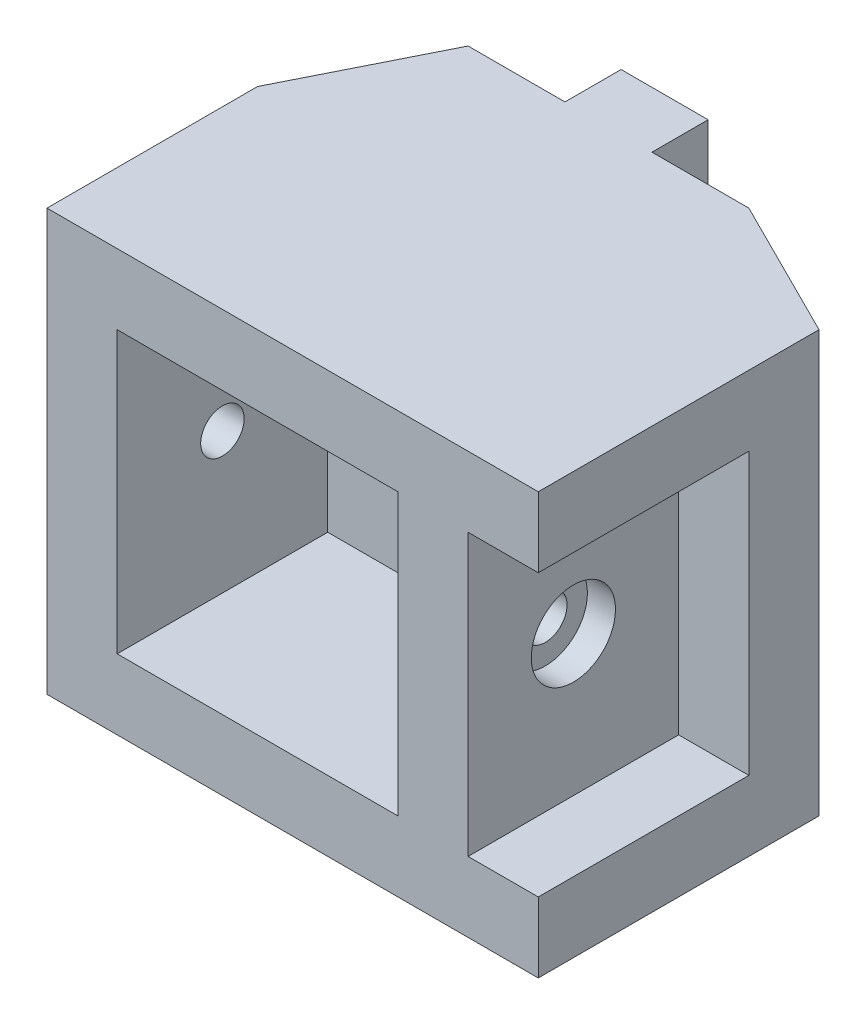
ISO-10303-21;
HEADER;
FILE_DESCRIPTION(('STEP AP214'),'2;1');
FILE_NAME('part.step','',(''),(''),'','','');
FILE_SCHEMA(('AUTOMOTIVE_DESIGN { 1 0 10303 214 1 1 1 1 }'));
ENDSEC;
DATA;
#1=APPLICATION_CONTEXT('core data for automotive mechanical design processes');
#2=APPLICATION_PROTOCOL_DEFINITION('international standard','automotive_design',2000,#1);
#3=PRODUCT_CONTEXT('',#1,'mechanical');
#4=PRODUCT('Part','Part','',(#3));
#5=PRODUCT_RELATED_PRODUCT_CATEGORY('part','',(#4));
#6=PRODUCT_DEFINITION_FORMATION('','',#4);
#7=PRODUCT_DEFINITION_CONTEXT('part definition',#1,'design');
#8=PRODUCT_DEFINITION('design','',#6,#7);
#9=PRODUCT_DEFINITION_SHAPE('','',#8);
#10=(LENGTH_UNIT() NAMED_UNIT(*) SI_UNIT(.MILLI.,.METRE.));
#11=(NAMED_UNIT(*) PLANE_ANGLE_UNIT() SI_UNIT($,.RADIAN.));
#12=(NAMED_UNIT(*) SI_UNIT($,.STERADIAN.) SOLID_ANGLE_UNIT());
#13=UNCERTAINTY_MEASURE_WITH_UNIT(LENGTH_MEASURE(1.E-05),#10,'distance_accuracy_value','');
#14=(GEOMETRIC_REPRESENTATION_CONTEXT(3) GLOBAL_UNCERTAINTY_ASSIGNED_CONTEXT((#13)) GLOBAL_UNIT_ASSIGNED_CONTEXT((#10,
#11,#12)) REPRESENTATION_CONTEXT('',''));
#15=CARTESIAN_POINT('',(0.,0.,0.));
#16=DIRECTION('',(0.,0.,1.));
#17=DIRECTION('',(1.,0.,0.));
#18=AXIS2_PLACEMENT_3D('',#15,#16,#17);
#19=CARTESIAN_POINT('',(0.,0.,0.));
#20=DIRECTION('',(0.,0.,1.));
#21=DIRECTION('',(1.,0.,0.));
#22=AXIS2_PLACEMENT_3D('',#19,#20,#21);
#23=PLANE('',#22);
#24=DIRECTION('',(1.,0.,0.));
#25=VECTOR('',#24,1.);
#26=CARTESIAN_POINT('',(0.,-15.,0.));
#27=LINE('',#26,#25);
#28=CARTESIAN_POINT('',(-3.1,-15.,0.));
#29=VERTEX_POINT('',#28);
#30=CARTESIAN_POINT('',(3.1,-15.,0.));
#31=VERTEX_POINT('',#30);
#32=EDGE_CURVE('E474',#29,#31,#27,.T.);
#33=ORIENTED_EDGE('',*,*,#32,.F.);
#34=DIRECTION('',(0.,1.,0.));
#35=VECTOR('',#34,1.);
#36=CARTESIAN_POINT('',(-3.1,-22.,0.));
#37=LINE('',#36,#35);
#38=CARTESIAN_POINT('',(-3.1,-3.1,0.));
#39=VERTEX_POINT('',#38);
#40=EDGE_CURVE('E334',#29,#39,#37,.T.);
#41=ORIENTED_EDGE('',*,*,#40,.T.);
#42=DIRECTION('',(-1.,0.,0.));
#43=VECTOR('',#42,1.);
#44=CARTESIAN_POINT('',(3.1,-3.1,0.));
#45=LINE('',#44,#43);
#46=CARTESIAN_POINT('',(3.1,-3.1,0.));
#47=VERTEX_POINT('',#46);
#48=EDGE_CURVE('E312',#47,#39,#45,.T.);
#49=ORIENTED_EDGE('',*,*,#48,.F.);
#50=DIRECTION('',(0.,1.,0.));
#51=VECTOR('',#50,1.);
#52=CARTESIAN_POINT('',(3.1,-22.,0.));
#53=LINE('',#52,#51);
#54=EDGE_CURVE('E340',#31,#47,#53,.T.);
#55=ORIENTED_EDGE('',*,*,#54,.F.);
#56=EDGE_LOOP('',(#33,#41,#49,#55));
#57=FACE_BOUND('',#56,.T.);
#58=ADVANCED_FACE('F72',(#57),#23,.F.);
#59=CARTESIAN_POINT('',(3.1,-22.,0.));
#60=DIRECTION('',(1.,0.,0.));
#61=DIRECTION('',(0.,0.,-1.));
#62=AXIS2_PLACEMENT_3D('',#59,#60,#61);
#63=PLANE('',#62);
#64=DIRECTION('',(0.,1.,0.));
#65=VECTOR('',#64,1.);
#66=CARTESIAN_POINT('',(3.1,-22.,4.));
#67=LINE('',#66,#65);
#68=CARTESIAN_POINT('',(3.1,-15.,4.));
#69=VERTEX_POINT('',#68);
#70=CARTESIAN_POINT('',(3.1,-3.1,4.));
#71=VERTEX_POINT('',#70);
#72=EDGE_CURVE('E343',#69,#71,#67,.T.);
#73=ORIENTED_EDGE('',*,*,#72,.F.);
#74=DIRECTION('',(0.,0.,-1.));
#75=VECTOR('',#74,1.);
#76=CARTESIAN_POINT('',(3.1,-15.,0.));
#77=LINE('',#76,#75);
#78=EDGE_CURVE('E479',#69,#31,#77,.T.);
#79=ORIENTED_EDGE('',*,*,#78,.T.);
#80=ORIENTED_EDGE('',*,*,#54,.T.);
#81=DIRECTION('',(0.,0.,-1.));
#82=VECTOR('',#81,1.);
#83=CARTESIAN_POINT('',(3.1,-3.1,4.));
#84=LINE('',#83,#82);
#85=EDGE_CURVE('E325',#71,#47,#84,.T.);
#86=ORIENTED_EDGE('',*,*,#85,.F.);
#87=EDGE_LOOP('',(#73,#79,#80,#86));
#88=FACE_BOUND('',#87,.T.);
#89=ADVANCED_FACE('F465',(#88),#63,.T.);
#90=CARTESIAN_POINT('',(-3.1,-22.,0.));
#91=DIRECTION('',(-1.,0.,0.));
#92=DIRECTION('',(0.,0.,1.));
#93=AXIS2_PLACEMENT_3D('',#90,#91,#92);
#94=PLANE('',#93);
#95=ORIENTED_EDGE('',*,*,#40,.F.);
#96=DIRECTION('',(0.,0.,1.));
#97=VECTOR('',#96,1.);
#98=CARTESIAN_POINT('',(-3.1,-15.,0.));
#99=LINE('',#98,#97);
#100=CARTESIAN_POINT('',(-3.1,-15.,4.));
#101=VERTEX_POINT('',#100);
#102=EDGE_CURVE('E478',#29,#101,#99,.T.);
#103=ORIENTED_EDGE('',*,*,#102,.T.);
#104=DIRECTION('',(0.,1.,0.));
#105=VECTOR('',#104,1.);
#106=CARTESIAN_POINT('',(-3.1,-22.,4.));
#107=LINE('',#106,#105);
#108=CARTESIAN_POINT('',(-3.1,-3.1,4.));
#109=VERTEX_POINT('',#108);
#110=EDGE_CURVE('E330',#101,#109,#107,.T.);
#111=ORIENTED_EDGE('',*,*,#110,.T.);
#112=DIRECTION('',(0.,0.,-1.));
#113=VECTOR('',#112,1.);
#114=CARTESIAN_POINT('',(-3.1,-3.1,4.));
#115=LINE('',#114,#113);
#116=EDGE_CURVE('E322',#109,#39,#115,.T.);
#117=ORIENTED_EDGE('',*,*,#116,.T.);
#118=EDGE_LOOP('',(#95,#103,#111,#117));
#119=FACE_BOUND('',#118,.T.);
#120=ADVANCED_FACE('F470',(#119),#94,.T.);
#121=CARTESIAN_POINT('',(0.,-22.,4.));
#122=DIRECTION('',(0.,0.,-1.));
#123=DIRECTION('',(-1.,0.,0.));
#124=AXIS2_PLACEMENT_3D('',#121,#122,#123);
#125=PLANE('',#124);
#126=DIRECTION('',(-1.,0.,0.));
#127=VECTOR('',#126,1.);
#128=CARTESIAN_POINT('',(0.,15.,4.));
#129=LINE('',#128,#127);
#130=CARTESIAN_POINT('',(10.,15.,4.));
#131=VERTEX_POINT('',#130);
#132=CARTESIAN_POINT('',(3.1,15.,4.));
#133=VERTEX_POINT('',#132);
#134=EDGE_CURVE('E228',#131,#133,#129,.T.);
#135=ORIENTED_EDGE('',*,*,#134,.F.);
#136=DIRECTION('',(0.,1.,0.));
#137=VECTOR('',#136,1.);
#138=CARTESIAN_POINT('',(10.,-22.,4.));
#139=LINE('',#138,#137);
#140=CARTESIAN_POINT('',(10.,-15.,3.99999999999999));
#141=VERTEX_POINT('',#140);
#142=EDGE_CURVE('E337',#141,#131,#139,.T.);
#143=ORIENTED_EDGE('',*,*,#142,.F.);
#144=DIRECTION('',(-1.,0.,0.));
#145=VECTOR('',#144,1.);
#146=CARTESIAN_POINT('',(0.,-15.,4.));
#147=LINE('',#146,#145);
#148=EDGE_CURVE('E366',#141,#69,#147,.T.);
#149=ORIENTED_EDGE('',*,*,#148,.T.);
#150=ORIENTED_EDGE('',*,*,#72,.T.);
#151=DIRECTION('',(-1.,0.,0.));
#152=VECTOR('',#151,1.);
#153=CARTESIAN_POINT('',(3.1,-3.1,4.));
#154=LINE('',#153,#152);
#155=EDGE_CURVE('E311',#71,#109,#154,.T.);
#156=ORIENTED_EDGE('',*,*,#155,.T.);
#157=ORIENTED_EDGE('',*,*,#110,.F.);
#158=CARTESIAN_POINT('',(-10.,-15.,4.));
#159=VERTEX_POINT('',#158);
#160=EDGE_CURVE('E229',#101,#159,#147,.T.);
#161=ORIENTED_EDGE('',*,*,#160,.T.);
#162=DIRECTION('',(0.,1.,0.));
#163=VECTOR('',#162,1.);
#164=CARTESIAN_POINT('',(-10.,-22.,4.));
#165=LINE('',#164,#163);
#166=CARTESIAN_POINT('',(-10.,15.,4.));
#167=VERTEX_POINT('',#166);
#168=EDGE_CURVE('E225',#159,#167,#165,.T.);
#169=ORIENTED_EDGE('',*,*,#168,.T.);
#170=CARTESIAN_POINT('',(-3.1,15.,4.));
#171=VERTEX_POINT('',#170);
#172=EDGE_CURVE('E374',#171,#167,#129,.T.);
#173=ORIENTED_EDGE('',*,*,#172,.F.);
#174=CARTESIAN_POINT('',(-3.1,3.1,4.));
#175=VERTEX_POINT('',#174);
#176=EDGE_CURVE('E332',#175,#171,#107,.T.);
#177=ORIENTED_EDGE('',*,*,#176,.F.);
#178=DIRECTION('',(1.,0.,0.));
#179=VECTOR('',#178,1.);
#180=CARTESIAN_POINT('',(-3.1,3.1,4.));
#181=LINE('',#180,#179);
#182=CARTESIAN_POINT('',(3.1,3.1,4.));
#183=VERTEX_POINT('',#182);
#184=EDGE_CURVE('E308',#175,#183,#181,.T.);
#185=ORIENTED_EDGE('',*,*,#184,.T.);
#186=EDGE_CURVE('E321',#183,#133,#67,.T.);
#187=ORIENTED_EDGE('',*,*,#186,.T.);
#188=EDGE_LOOP('',(#135,#143,#149,#150,#156,#157,#161,#169,#173,#177,#185,#187));
#189=FACE_BOUND('',#188,.T.);
#190=CARTESIAN_POINT('',(0.,0.,4.));
#191=DIRECTION('',(0.,0.,1.));
#192=DIRECTION('',(1.,0.,0.));
#193=AXIS2_PLACEMENT_3D('',#190,#191,#192);
#194=CIRCLE('',#193,2.6);
#195=CARTESIAN_POINT('',(2.6,0.,4.));
#196=VERTEX_POINT('',#195);
#197=EDGE_CURVE('E296',#196,#196,#194,.T.);
#198=ORIENTED_EDGE('',*,*,#197,.T.);
#199=EDGE_LOOP('',(#198));
#200=FACE_BOUND('',#199,.T.);
#201=ADVANCED_FACE('F364',(#189,#200),#125,.T.);
#202=CARTESIAN_POINT('',(-6.4,-22.,-3.2));
#203=DIRECTION('',(0.894427190999916,0.,0.447213595499958));
#204=DIRECTION('',(0.447213595499958,0.,-0.894427190999916));
#205=AXIS2_PLACEMENT_3D('',#202,#203,#204);
#206=PLANE('',#205);
#207=DIRECTION('',(0.,-1.,0.));
#208=VECTOR('',#207,1.);
#209=CARTESIAN_POINT('',(-15.,0.,14.));
#210=LINE('',#209,#208);
#211=CARTESIAN_POINT('',(-15.,15.,14.));
#212=VERTEX_POINT('',#211);
#213=CARTESIAN_POINT('',(-15.,-15.,14.));
#214=VERTEX_POINT('',#213);
#215=EDGE_CURVE('E223',#212,#214,#210,.T.);
#216=ORIENTED_EDGE('',*,*,#215,.F.);
#217=DIRECTION('',(0.447213595499958,0.,-0.894427190999916));
#218=VECTOR('',#217,1.);
#219=CARTESIAN_POINT('',(-6.4,15.,-3.2));
#220=LINE('',#219,#218);
#221=EDGE_CURVE('E377',#212,#167,#220,.T.);
#222=ORIENTED_EDGE('',*,*,#221,.T.);
#223=ORIENTED_EDGE('',*,*,#168,.F.);
#224=DIRECTION('',(0.447213595499958,0.,-0.894427190999916));
#225=VECTOR('',#224,1.);
#226=CARTESIAN_POINT('',(-6.4,-15.,-3.2));
#227=LINE('',#226,#225);
#228=EDGE_CURVE('E218',#214,#159,#227,.T.);
#229=ORIENTED_EDGE('',*,*,#228,.F.);
#230=EDGE_LOOP('',(#216,#222,#223,#229));
#231=FACE_BOUND('',#230,.T.);
#232=ADVANCED_FACE('F220',(#231),#206,.F.);
#233=CARTESIAN_POINT('',(20.,22.,9.));
#234=DIRECTION('',(1.,0.,0.));
#235=DIRECTION('',(0.,1.,0.));
#236=AXIS2_PLACEMENT_3D('',#233,#234,#235);
#237=PLANE('',#236);
#238=DIRECTION('',(0.,-1.,0.));
#239=VECTOR('',#238,1.);
#240=CARTESIAN_POINT('',(20.,22.,9.));
#241=LINE('',#240,#239);
#242=CARTESIAN_POINT('',(20.,15.,9.));
#243=VERTEX_POINT('',#242);
#244=CARTESIAN_POINT('',(20.,-15.,9.));
#245=VERTEX_POINT('',#244);
#246=EDGE_CURVE('E275',#243,#245,#241,.T.);
#247=ORIENTED_EDGE('',*,*,#246,.F.);
#248=DIRECTION('',(0.,0.,-1.));
#249=VECTOR('',#248,1.);
#250=CARTESIAN_POINT('',(20.,15.,29.));
#251=LINE('',#250,#249);
#252=CARTESIAN_POINT('',(20.,15.,29.));
#253=VERTEX_POINT('',#252);
#254=EDGE_CURVE('E284',#253,#243,#251,.T.);
#255=ORIENTED_EDGE('',*,*,#254,.F.);
#256=DIRECTION('',(0.,1.,0.));
#257=VECTOR('',#256,1.);
#258=CARTESIAN_POINT('',(20.,0.,29.));
#259=LINE('',#258,#257);
#260=CARTESIAN_POINT('',(20.,10.,29.));
#261=VERTEX_POINT('',#260);
#262=EDGE_CURVE('E407',#261,#253,#259,.T.);
#263=ORIENTED_EDGE('',*,*,#262,.F.);
#264=DIRECTION('',(0.,0.,-1.));
#265=VECTOR('',#264,1.);
#266=CARTESIAN_POINT('',(20.,10.,29.));
#267=LINE('',#266,#265);
#268=CARTESIAN_POINT('',(20.,10.,14.));
#269=VERTEX_POINT('',#268);
#270=EDGE_CURVE('E286',#261,#269,#267,.T.);
#271=ORIENTED_EDGE('',*,*,#270,.T.);
#272=DIRECTION('',(0.,-1.,0.));
#273=VECTOR('',#272,1.);
#274=CARTESIAN_POINT('',(20.,22.,14.));
#275=LINE('',#274,#273);
#276=CARTESIAN_POINT('',(20.,-9.99999999999999,14.));
#277=VERTEX_POINT('',#276);
#278=EDGE_CURVE('E292',#269,#277,#275,.T.);
#279=ORIENTED_EDGE('',*,*,#278,.T.);
#280=DIRECTION('',(0.,0.,-1.));
#281=VECTOR('',#280,1.);
#282=CARTESIAN_POINT('',(20.,-9.99999999999999,29.));
#283=LINE('',#282,#281);
#284=CARTESIAN_POINT('',(20.,-9.99999999999999,29.));
#285=VERTEX_POINT('',#284);
#286=EDGE_CURVE('E278',#285,#277,#283,.T.);
#287=ORIENTED_EDGE('',*,*,#286,.F.);
#288=DIRECTION('',(0.,1.,0.));
#289=VECTOR('',#288,1.);
#290=CARTESIAN_POINT('',(20.,0.,29.));
#291=LINE('',#290,#289);
#292=CARTESIAN_POINT('',(20.,-15.,29.));
#293=VERTEX_POINT('',#292);
#294=EDGE_CURVE('E413',#293,#285,#291,.T.);
#295=ORIENTED_EDGE('',*,*,#294,.F.);
#296=DIRECTION('',(0.,0.,-1.));
#297=VECTOR('',#296,1.);
#298=CARTESIAN_POINT('',(20.,-15.,29.));
#299=LINE('',#298,#297);
#300=EDGE_CURVE('E240',#293,#245,#299,.T.);
#301=ORIENTED_EDGE('',*,*,#300,.T.);
#302=EDGE_LOOP('',(#247,#255,#263,#271,#279,#287,#295,#301));
#303=FACE_BOUND('',#302,.T.);
#304=ADVANCED_FACE('F523',(#303),#237,.T.);
#305=CARTESIAN_POINT('',(10.,22.,4.));
#306=DIRECTION('',(0.447213595499958,0.,-0.894427190999916));
#307=DIRECTION('',(-0.894427190999916,0.,-0.447213595499958));
#308=AXIS2_PLACEMENT_3D('',#305,#306,#307);
#309=PLANE('',#308);
#310=DIRECTION('',(-0.894427190999916,0.,-0.447213595499958));
#311=VECTOR('',#310,1.);
#312=CARTESIAN_POINT('',(10.,15.,4.));
#313=LINE('',#312,#311);
#314=EDGE_CURVE('E12',#243,#131,#313,.T.);
#315=ORIENTED_EDGE('',*,*,#314,.F.);
#316=ORIENTED_EDGE('',*,*,#246,.T.);
#317=DIRECTION('',(-0.894427190999916,0.,-0.447213595499958));
#318=VECTOR('',#317,1.);
#319=CARTESIAN_POINT('',(10.,-15.,3.99999999999999));
#320=LINE('',#319,#318);
#321=EDGE_CURVE('E79',#245,#141,#320,.T.);
#322=ORIENTED_EDGE('',*,*,#321,.T.);
#323=ORIENTED_EDGE('',*,*,#142,.T.);
#324=EDGE_LOOP('',(#315,#316,#322,#323));
#325=FACE_BOUND('',#324,.T.);
#326=ADVANCED_FACE('F359',(#325),#309,.T.);
#327=CARTESIAN_POINT('',(-20.,0.,21.5));
#328=DIRECTION('',(1.,0.,0.));
#329=DIRECTION('',(0.,0.,-1.));
#330=AXIS2_PLACEMENT_3D('',#327,#328,#329);
#331=CYLINDRICAL_SURFACE('',#330,1.55);
#332=CARTESIAN_POINT('',(-10.,0.,21.5));
#333=DIRECTION('',(1.,0.,0.));
#334=DIRECTION('',(0.,0.,-1.));
#335=AXIS2_PLACEMENT_3D('',#332,#333,#334);
#336=CIRCLE('',#335,1.55);
#337=CARTESIAN_POINT('',(-10.,0.,19.95));
#338=VERTEX_POINT('',#337);
#339=EDGE_CURVE('E400',#338,#338,#336,.T.);
#340=ORIENTED_EDGE('',*,*,#339,.T.);
#341=EDGE_LOOP('',(#340));
#342=FACE_BOUND('',#341,.T.);
#343=CARTESIAN_POINT('',(-13.,0.,21.5));
#344=DIRECTION('',(-1.,0.,0.));
#345=DIRECTION('',(0.,-1.,0.));
#346=AXIS2_PLACEMENT_3D('',#343,#344,#345);
#347=CIRCLE('',#346,1.55);
#348=CARTESIAN_POINT('',(-13.,-1.55,21.5));
#349=VERTEX_POINT('',#348);
#350=EDGE_CURVE('E350',#349,#349,#347,.F.);
#351=ORIENTED_EDGE('',*,*,#350,.F.);
#352=EDGE_LOOP('',(#351));
#353=FACE_BOUND('',#352,.T.);
#354=ADVANCED_FACE('F456',(#342,#353),#331,.F.);
#355=CARTESIAN_POINT('',(15.,0.,21.5));
#356=DIRECTION('',(-1.,0.,0.));
#357=DIRECTION('',(0.,-1.,0.));
#358=AXIS2_PLACEMENT_3D('',#355,#356,#357);
#359=CYLINDRICAL_SURFACE('',#358,1.55);
#360=CARTESIAN_POINT('',(10.,0.,21.5));
#361=DIRECTION('',(1.,0.,0.));
#362=DIRECTION('',(0.,0.,-1.));
#363=AXIS2_PLACEMENT_3D('',#360,#361,#362);
#364=CIRCLE('',#363,1.55);
#365=CARTESIAN_POINT('',(10.,0.,19.95));
#366=VERTEX_POINT('',#365);
#367=EDGE_CURVE('E348',#366,#366,#364,.F.);
#368=ORIENTED_EDGE('',*,*,#367,.T.);
#369=EDGE_LOOP('',(#368));
#370=FACE_BOUND('',#369,.T.);
#371=CARTESIAN_POINT('',(13.,0.,21.5));
#372=DIRECTION('',(1.,0.,0.));
#373=DIRECTION('',(0.,0.,-1.));
#374=AXIS2_PLACEMENT_3D('',#371,#372,#373);
#375=CIRCLE('',#374,1.55);
#376=CARTESIAN_POINT('',(13.,0.,19.95));
#377=VERTEX_POINT('',#376);
#378=EDGE_CURVE('E345',#377,#377,#375,.T.);
#379=ORIENTED_EDGE('',*,*,#378,.T.);
#380=EDGE_LOOP('',(#379));
#381=FACE_BOUND('',#380,.T.);
#382=ADVANCED_FACE('F447',(#370,#381),#359,.F.);
#383=CARTESIAN_POINT('',(0.,0.,14.));
#384=DIRECTION('',(0.,0.,1.));
#385=DIRECTION('',(1.,0.,0.));
#386=AXIS2_PLACEMENT_3D('',#383,#384,#385);
#387=PLANE('',#386);
#388=CARTESIAN_POINT('',(0.,0.,14.));
#389=DIRECTION('',(0.,0.,1.));
#390=DIRECTION('',(1.,0.,0.));
#391=AXIS2_PLACEMENT_3D('',#388,#389,#390);
#392=CIRCLE('',#391,4.);
#393=CARTESIAN_POINT('',(4.,0.,14.));
#394=VERTEX_POINT('',#393);
#395=EDGE_CURVE('E299',#394,#394,#392,.T.);
#396=ORIENTED_EDGE('',*,*,#395,.F.);
#397=EDGE_LOOP('',(#396));
#398=FACE_BOUND('',#397,.T.);
#399=DIRECTION('',(0.,-1.,0.));
#400=VECTOR('',#399,1.);
#401=CARTESIAN_POINT('',(10.,0.,14.));
#402=LINE('',#401,#400);
#403=CARTESIAN_POINT('',(10.,10.,14.));
#404=VERTEX_POINT('',#403);
#405=CARTESIAN_POINT('',(10.,-10.,14.));
#406=VERTEX_POINT('',#405);
#407=EDGE_CURVE('E253',#404,#406,#402,.T.);
#408=ORIENTED_EDGE('',*,*,#407,.F.);
#409=DIRECTION('',(-1.,0.,0.));
#410=VECTOR('',#409,1.);
#411=CARTESIAN_POINT('',(0.,10.,14.));
#412=LINE('',#411,#410);
#413=CARTESIAN_POINT('',(-10.,10.,14.));
#414=VERTEX_POINT('',#413);
#415=EDGE_CURVE('E247',#404,#414,#412,.T.);
#416=ORIENTED_EDGE('',*,*,#415,.T.);
#417=DIRECTION('',(0.,1.,0.));
#418=VECTOR('',#417,1.);
#419=CARTESIAN_POINT('',(-10.,0.,14.));
#420=LINE('',#419,#418);
#421=CARTESIAN_POINT('',(-10.,-10.,14.));
#422=VERTEX_POINT('',#421);
#423=EDGE_CURVE('E258',#422,#414,#420,.T.);
#424=ORIENTED_EDGE('',*,*,#423,.F.);
#425=DIRECTION('',(1.,0.,0.));
#426=VECTOR('',#425,1.);
#427=CARTESIAN_POINT('',(0.,-10.,14.));
#428=LINE('',#427,#426);
#429=EDGE_CURVE('E256',#422,#406,#428,.T.);
#430=ORIENTED_EDGE('',*,*,#429,.T.);
#431=EDGE_LOOP('',(#408,#416,#424,#430));
#432=FACE_BOUND('',#431,.T.);
#433=ADVANCED_FACE('F444',(#398,#432),#387,.T.);
#434=CARTESIAN_POINT('',(-3.1,3.1,0.));
#435=VERTEX_POINT('',#434);
#436=CARTESIAN_POINT('',(-3.1,15.,0.));
#437=VERTEX_POINT('',#436);
#438=EDGE_CURVE('E336',#435,#437,#37,.T.);
#439=ORIENTED_EDGE('',*,*,#438,.T.);
#440=DIRECTION('',(1.,0.,0.));
#441=VECTOR('',#440,1.);
#442=CARTESIAN_POINT('',(0.,15.,0.));
#443=LINE('',#442,#441);
#444=CARTESIAN_POINT('',(3.1,15.,0.));
#445=VERTEX_POINT('',#444);
#446=EDGE_CURVE('E375',#437,#445,#443,.T.);
#447=ORIENTED_EDGE('',*,*,#446,.T.);
#448=CARTESIAN_POINT('',(3.1,3.1,0.));
#449=VERTEX_POINT('',#448);
#450=EDGE_CURVE('E342',#449,#445,#53,.T.);
#451=ORIENTED_EDGE('',*,*,#450,.F.);
#452=DIRECTION('',(1.,0.,0.));
#453=VECTOR('',#452,1.);
#454=CARTESIAN_POINT('',(-3.1,3.1,0.));
#455=LINE('',#454,#453);
#456=EDGE_CURVE('E305',#435,#449,#455,.T.);
#457=ORIENTED_EDGE('',*,*,#456,.F.);
#458=EDGE_LOOP('',(#439,#447,#451,#457));
#459=FACE_BOUND('',#458,.T.);
#460=ADVANCED_FACE('F446',(#459),#23,.F.);
#461=DIRECTION('',(0.,0.,-1.));
#462=VECTOR('',#461,1.);
#463=CARTESIAN_POINT('',(3.1,15.,0.));
#464=LINE('',#463,#462);
#465=EDGE_CURVE('E372',#133,#445,#464,.T.);
#466=ORIENTED_EDGE('',*,*,#465,.F.);
#467=ORIENTED_EDGE('',*,*,#186,.F.);
#468=DIRECTION('',(0.,0.,-1.));
#469=VECTOR('',#468,1.);
#470=CARTESIAN_POINT('',(3.1,3.1,4.));
#471=LINE('',#470,#469);
#472=EDGE_CURVE('E315',#183,#449,#471,.T.);
#473=ORIENTED_EDGE('',*,*,#472,.T.);
#474=ORIENTED_EDGE('',*,*,#450,.T.);
#475=EDGE_LOOP('',(#466,#467,#473,#474));
#476=FACE_BOUND('',#475,.T.);
#477=ADVANCED_FACE('F454',(#476),#63,.T.);
#478=DIRECTION('',(0.,0.,1.));
#479=VECTOR('',#478,1.);
#480=CARTESIAN_POINT('',(-3.1,15.,0.));
#481=LINE('',#480,#479);
#482=EDGE_CURVE('E378',#437,#171,#481,.T.);
#483=ORIENTED_EDGE('',*,*,#482,.F.);
#484=ORIENTED_EDGE('',*,*,#438,.F.);
#485=DIRECTION('',(0.,0.,-1.));
#486=VECTOR('',#485,1.);
#487=CARTESIAN_POINT('',(-3.1,3.1,4.));
#488=LINE('',#487,#486);
#489=EDGE_CURVE('E319',#175,#435,#488,.T.);
#490=ORIENTED_EDGE('',*,*,#489,.F.);
#491=ORIENTED_EDGE('',*,*,#176,.T.);
#492=EDGE_LOOP('',(#483,#484,#490,#491));
#493=FACE_BOUND('',#492,.T.);
#494=ADVANCED_FACE('F463',(#493),#94,.T.);
#495=DIRECTION('',(-1.,0.,0.));
#496=VECTOR('',#495,1.);
#497=CARTESIAN_POINT('',(0.,-10.,14.));
#498=LINE('',#497,#496);
#499=CARTESIAN_POINT('',(15.,-10.,14.));
#500=VERTEX_POINT('',#499);
#501=EDGE_CURVE('E244',#277,#500,#498,.T.);
#502=ORIENTED_EDGE('',*,*,#501,.F.);
#503=ORIENTED_EDGE('',*,*,#278,.F.);
#504=DIRECTION('',(1.,0.,0.));
#505=VECTOR('',#504,1.);
#506=CARTESIAN_POINT('',(0.,10.,14.));
#507=LINE('',#506,#505);
#508=CARTESIAN_POINT('',(15.,10.,14.));
#509=VERTEX_POINT('',#508);
#510=EDGE_CURVE('E91',#509,#269,#507,.T.);
#511=ORIENTED_EDGE('',*,*,#510,.F.);
#512=DIRECTION('',(0.,-1.,0.));
#513=VECTOR('',#512,1.);
#514=CARTESIAN_POINT('',(15.,0.,14.));
#515=LINE('',#514,#513);
#516=EDGE_CURVE('E86',#509,#500,#515,.T.);
#517=ORIENTED_EDGE('',*,*,#516,.T.);
#518=EDGE_LOOP('',(#502,#503,#511,#517));
#519=FACE_BOUND('',#518,.T.);
#520=ADVANCED_FACE('F449',(#519),#387,.T.);
#521=CARTESIAN_POINT('',(-3.1,3.1,4.));
#522=DIRECTION('',(0.,1.,0.));
#523=DIRECTION('',(0.,0.,1.));
#524=AXIS2_PLACEMENT_3D('',#521,#522,#523);
#525=PLANE('',#524);
#526=ORIENTED_EDGE('',*,*,#456,.T.);
#527=ORIENTED_EDGE('',*,*,#472,.F.);
#528=ORIENTED_EDGE('',*,*,#184,.F.);
#529=ORIENTED_EDGE('',*,*,#489,.T.);
#530=EDGE_LOOP('',(#526,#527,#528,#529));
#531=FACE_BOUND('',#530,.T.);
#532=ADVANCED_FACE('F462',(#531),#525,.F.);
#533=CARTESIAN_POINT('',(3.1,-3.1,4.));
#534=DIRECTION('',(0.,-1.,0.));
#535=DIRECTION('',(1.,0.,0.));
#536=AXIS2_PLACEMENT_3D('',#533,#534,#535);
#537=PLANE('',#536);
#538=ORIENTED_EDGE('',*,*,#48,.T.);
#539=ORIENTED_EDGE('',*,*,#116,.F.);
#540=ORIENTED_EDGE('',*,*,#155,.F.);
#541=ORIENTED_EDGE('',*,*,#85,.T.);
#542=EDGE_LOOP('',(#538,#539,#540,#541));
#543=FACE_BOUND('',#542,.T.);
#544=ADVANCED_FACE('F487',(#543),#537,.F.);
#545=CARTESIAN_POINT('',(0.,0.,9.));
#546=DIRECTION('',(0.,0.,1.));
#547=DIRECTION('',(1.,0.,0.));
#548=AXIS2_PLACEMENT_3D('',#545,#546,#547);
#549=CYLINDRICAL_SURFACE('',#548,4.);
#550=CARTESIAN_POINT('',(0.,0.,9.));
#551=DIRECTION('',(0.,0.,1.));
#552=DIRECTION('',(1.,0.,0.));
#553=AXIS2_PLACEMENT_3D('',#550,#551,#552);
#554=CIRCLE('',#553,4.);
#555=CARTESIAN_POINT('',(4.,0.,9.));
#556=VERTEX_POINT('',#555);
#557=EDGE_CURVE('E302',#556,#556,#554,.T.);
#558=ORIENTED_EDGE('',*,*,#557,.F.);
#559=EDGE_LOOP('',(#558));
#560=FACE_BOUND('',#559,.T.);
#561=ORIENTED_EDGE('',*,*,#395,.T.);
#562=EDGE_LOOP('',(#561));
#563=FACE_BOUND('',#562,.T.);
#564=ADVANCED_FACE('F534',(#560,#563),#549,.F.);
#565=CARTESIAN_POINT('',(0.,0.,9.));
#566=DIRECTION('',(0.,0.,1.));
#567=DIRECTION('',(1.,0.,0.));
#568=AXIS2_PLACEMENT_3D('',#565,#566,#567);
#569=PLANE('',#568);
#570=CARTESIAN_POINT('',(0.,0.,9.));
#571=DIRECTION('',(0.,0.,1.));
#572=DIRECTION('',(1.,0.,0.));
#573=AXIS2_PLACEMENT_3D('',#570,#571,#572);
#574=CIRCLE('',#573,2.6);
#575=CARTESIAN_POINT('',(2.6,0.,9.));
#576=VERTEX_POINT('',#575);
#577=EDGE_CURVE('E295',#576,#576,#574,.T.);
#578=ORIENTED_EDGE('',*,*,#577,.F.);
#579=EDGE_LOOP('',(#578));
#580=FACE_BOUND('',#579,.T.);
#581=ORIENTED_EDGE('',*,*,#557,.T.);
#582=EDGE_LOOP('',(#581));
#583=FACE_BOUND('',#582,.T.);
#584=ADVANCED_FACE('F530',(#580,#583),#569,.T.);
#585=CARTESIAN_POINT('',(0.,0.,4.));
#586=DIRECTION('',(0.,0.,1.));
#587=DIRECTION('',(1.,0.,0.));
#588=AXIS2_PLACEMENT_3D('',#585,#586,#587);
#589=CYLINDRICAL_SURFACE('',#588,2.6);
#590=ORIENTED_EDGE('',*,*,#197,.F.);
#591=EDGE_LOOP('',(#590));
#592=FACE_BOUND('',#591,.T.);
#593=ORIENTED_EDGE('',*,*,#577,.T.);
#594=EDGE_LOOP('',(#593));
#595=FACE_BOUND('',#594,.T.);
#596=ADVANCED_FACE('F527',(#592,#595),#589,.F.);
#597=CARTESIAN_POINT('',(0.,10.,29.));
#598=DIRECTION('',(0.,-1.,0.));
#599=DIRECTION('',(0.,0.,-1.));
#600=AXIS2_PLACEMENT_3D('',#597,#598,#599);
#601=PLANE('',#600);
#602=ORIENTED_EDGE('',*,*,#415,.F.);
#603=DIRECTION('',(0.,0.,-1.));
#604=VECTOR('',#603,1.);
#605=CARTESIAN_POINT('',(10.,10.,29.));
#606=LINE('',#605,#604);
#607=CARTESIAN_POINT('',(10.,10.,29.));
#608=VERTEX_POINT('',#607);
#609=EDGE_CURVE('E272',#608,#404,#606,.T.);
#610=ORIENTED_EDGE('',*,*,#609,.F.);
#611=DIRECTION('',(-1.,0.,0.));
#612=VECTOR('',#611,1.);
#613=CARTESIAN_POINT('',(0.,10.,29.));
#614=LINE('',#613,#612);
#615=CARTESIAN_POINT('',(-10.,10.,29.));
#616=VERTEX_POINT('',#615);
#617=EDGE_CURVE('E417',#608,#616,#614,.T.);
#618=ORIENTED_EDGE('',*,*,#617,.T.);
#619=DIRECTION('',(0.,0.,-1.));
#620=VECTOR('',#619,1.);
#621=CARTESIAN_POINT('',(-10.,10.,29.));
#622=LINE('',#621,#620);
#623=EDGE_CURVE('E262',#616,#414,#622,.T.);
#624=ORIENTED_EDGE('',*,*,#623,.T.);
#625=EDGE_LOOP('',(#602,#610,#618,#624));
#626=FACE_BOUND('',#625,.T.);
#627=ADVANCED_FACE('F435',(#626),#601,.T.);
#628=CARTESIAN_POINT('',(10.,0.,29.));
#629=DIRECTION('',(1.,0.,0.));
#630=DIRECTION('',(0.,0.,-1.));
#631=AXIS2_PLACEMENT_3D('',#628,#629,#630);
#632=PLANE('',#631);
#633=ORIENTED_EDGE('',*,*,#367,.F.);
#634=EDGE_LOOP('',(#633));
#635=FACE_BOUND('',#634,.T.);
#636=ORIENTED_EDGE('',*,*,#407,.T.);
#637=DIRECTION('',(0.,0.,-1.));
#638=VECTOR('',#637,1.);
#639=CARTESIAN_POINT('',(10.,-10.,29.));
#640=LINE('',#639,#638);
#641=CARTESIAN_POINT('',(10.,-10.,29.));
#642=VERTEX_POINT('',#641);
#643=EDGE_CURVE('E269',#642,#406,#640,.T.);
#644=ORIENTED_EDGE('',*,*,#643,.F.);
#645=DIRECTION('',(0.,-1.,0.));
#646=VECTOR('',#645,1.);
#647=CARTESIAN_POINT('',(10.,0.,29.));
#648=LINE('',#647,#646);
#649=EDGE_CURVE('E420',#608,#642,#648,.T.);
#650=ORIENTED_EDGE('',*,*,#649,.F.);
#651=ORIENTED_EDGE('',*,*,#609,.T.);
#652=EDGE_LOOP('',(#636,#644,#650,#651));
#653=FACE_BOUND('',#652,.T.);
#654=ADVANCED_FACE('F439',(#635,#653),#632,.F.);
#655=CARTESIAN_POINT('',(0.,-10.,29.));
#656=DIRECTION('',(0.,1.,0.));
#657=DIRECTION('',(0.,0.,1.));
#658=AXIS2_PLACEMENT_3D('',#655,#656,#657);
#659=PLANE('',#658);
#660=ORIENTED_EDGE('',*,*,#429,.F.);
#661=DIRECTION('',(0.,0.,-1.));
#662=VECTOR('',#661,1.);
#663=CARTESIAN_POINT('',(-10.,-10.,29.));
#664=LINE('',#663,#662);
#665=CARTESIAN_POINT('',(-10.,-10.,29.));
#666=VERTEX_POINT('',#665);
#667=EDGE_CURVE('E265',#666,#422,#664,.T.);
#668=ORIENTED_EDGE('',*,*,#667,.F.);
#669=DIRECTION('',(1.,0.,0.));
#670=VECTOR('',#669,1.);
#671=CARTESIAN_POINT('',(0.,-10.,29.));
#672=LINE('',#671,#670);
#673=EDGE_CURVE('E422',#666,#642,#672,.T.);
#674=ORIENTED_EDGE('',*,*,#673,.T.);
#675=ORIENTED_EDGE('',*,*,#643,.T.);
#676=EDGE_LOOP('',(#660,#668,#674,#675));
#677=FACE_BOUND('',#676,.T.);
#678=ADVANCED_FACE('F442',(#677),#659,.T.);
#679=CARTESIAN_POINT('',(15.,0.,29.));
#680=DIRECTION('',(1.,0.,0.));
#681=DIRECTION('',(0.,0.,-1.));
#682=AXIS2_PLACEMENT_3D('',#679,#680,#681);
#683=PLANE('',#682);
#684=CARTESIAN_POINT('',(15.,0.,21.5));
#685=DIRECTION('',(1.,0.,0.));
#686=DIRECTION('',(0.,0.,-1.));
#687=AXIS2_PLACEMENT_3D('',#684,#685,#686);
#688=CIRCLE('',#687,3.);
#689=CARTESIAN_POINT('',(15.,0.,18.5));
#690=VERTEX_POINT('',#689);
#691=EDGE_CURVE('E352',#690,#690,#688,.T.);
#692=ORIENTED_EDGE('',*,*,#691,.F.);
#693=EDGE_LOOP('',(#692));
#694=FACE_BOUND('',#693,.T.);
#695=ORIENTED_EDGE('',*,*,#516,.F.);
#696=DIRECTION('',(0.,0.,-1.));
#697=VECTOR('',#696,1.);
#698=CARTESIAN_POINT('',(15.,10.,29.));
#699=LINE('',#698,#697);
#700=CARTESIAN_POINT('',(15.,10.,29.));
#701=VERTEX_POINT('',#700);
#702=EDGE_CURVE('E266',#701,#509,#699,.T.);
#703=ORIENTED_EDGE('',*,*,#702,.F.);
#704=DIRECTION('',(0.,-1.,0.));
#705=VECTOR('',#704,1.);
#706=CARTESIAN_POINT('',(15.,0.,29.));
#707=LINE('',#706,#705);
#708=CARTESIAN_POINT('',(15.,-10.,29.));
#709=VERTEX_POINT('',#708);
#710=EDGE_CURVE('E261',#701,#709,#707,.T.);
#711=ORIENTED_EDGE('',*,*,#710,.T.);
#712=DIRECTION('',(0.,0.,-1.));
#713=VECTOR('',#712,1.);
#714=CARTESIAN_POINT('',(15.,-10.,29.));
#715=LINE('',#714,#713);
#716=EDGE_CURVE('E276',#709,#500,#715,.T.);
#717=ORIENTED_EDGE('',*,*,#716,.T.);
#718=EDGE_LOOP('',(#695,#703,#711,#717));
#719=FACE_BOUND('',#718,.T.);
#720=ADVANCED_FACE('F513',(#694,#719),#683,.T.);
#721=CARTESIAN_POINT('',(0.,10.,29.));
#722=DIRECTION('',(0.,1.,0.));
#723=DIRECTION('',(0.,0.,1.));
#724=AXIS2_PLACEMENT_3D('',#721,#722,#723);
#725=PLANE('',#724);
#726=ORIENTED_EDGE('',*,*,#510,.T.);
#727=ORIENTED_EDGE('',*,*,#270,.F.);
#728=DIRECTION('',(1.,0.,0.));
#729=VECTOR('',#728,1.);
#730=CARTESIAN_POINT('',(0.,10.,29.));
#731=LINE('',#730,#729);
#732=EDGE_CURVE('E405',#701,#261,#731,.T.);
#733=ORIENTED_EDGE('',*,*,#732,.F.);
#734=ORIENTED_EDGE('',*,*,#702,.T.);
#735=EDGE_LOOP('',(#726,#727,#733,#734));
#736=FACE_BOUND('',#735,.T.);
#737=ADVANCED_FACE('F505',(#736),#725,.F.);
#738=CARTESIAN_POINT('',(0.,15.,29.));
#739=DIRECTION('',(0.,1.,0.));
#740=DIRECTION('',(0.,0.,1.));
#741=AXIS2_PLACEMENT_3D('',#738,#739,#740);
#742=PLANE('',#741);
#743=ORIENTED_EDGE('',*,*,#254,.T.);
#744=ORIENTED_EDGE('',*,*,#314,.T.);
#745=ORIENTED_EDGE('',*,*,#134,.T.);
#746=ORIENTED_EDGE('',*,*,#465,.T.);
#747=ORIENTED_EDGE('',*,*,#446,.F.);
#748=ORIENTED_EDGE('',*,*,#482,.T.);
#749=ORIENTED_EDGE('',*,*,#172,.T.);
#750=ORIENTED_EDGE('',*,*,#221,.F.);
#751=DIRECTION('',(0.,0.,-1.));
#752=VECTOR('',#751,1.);
#753=CARTESIAN_POINT('',(-15.,15.,29.));
#754=LINE('',#753,#752);
#755=CARTESIAN_POINT('',(-15.,15.,29.));
#756=VERTEX_POINT('',#755);
#757=EDGE_CURVE('E239',#756,#212,#754,.T.);
#758=ORIENTED_EDGE('',*,*,#757,.F.);
#759=DIRECTION('',(1.,0.,0.));
#760=VECTOR('',#759,1.);
#761=CARTESIAN_POINT('',(-15.,15.,29.));
#762=LINE('',#761,#760);
#763=EDGE_CURVE('E380',#756,#253,#762,.T.);
#764=ORIENTED_EDGE('',*,*,#763,.T.);
#765=EDGE_LOOP('',(#743,#744,#745,#746,#747,#748,#749,#750,#758,#764));
#766=FACE_BOUND('',#765,.T.);
#767=ADVANCED_FACE('F503',(#766),#742,.T.);
#768=CARTESIAN_POINT('',(-15.,0.,29.));
#769=DIRECTION('',(1.,0.,0.));
#770=DIRECTION('',(0.,1.,0.));
#771=AXIS2_PLACEMENT_3D('',#768,#769,#770);
#772=PLANE('',#771);
#773=CARTESIAN_POINT('',(-15.,0.,21.5));
#774=DIRECTION('',(-1.,0.,0.));
#775=DIRECTION('',(0.,-1.,0.));
#776=AXIS2_PLACEMENT_3D('',#773,#774,#775);
#777=CIRCLE('',#776,3.);
#778=CARTESIAN_POINT('',(-15.,-3.,21.5));
#779=VERTEX_POINT('',#778);
#780=EDGE_CURVE('E389',#779,#779,#777,.T.);
#781=ORIENTED_EDGE('',*,*,#780,.F.);
#782=EDGE_LOOP('',(#781));
#783=FACE_BOUND('',#782,.T.);
#784=DIRECTION('',(0.,-1.,0.));
#785=VECTOR('',#784,1.);
#786=CARTESIAN_POINT('',(-15.,0.,29.));
#787=LINE('',#786,#785);
#788=CARTESIAN_POINT('',(-15.,-15.,29.));
#789=VERTEX_POINT('',#788);
#790=EDGE_CURVE('E410',#756,#789,#787,.T.);
#791=ORIENTED_EDGE('',*,*,#790,.F.);
#792=ORIENTED_EDGE('',*,*,#757,.T.);
#793=ORIENTED_EDGE('',*,*,#215,.T.);
#794=DIRECTION('',(0.,0.,-1.));
#795=VECTOR('',#794,1.);
#796=CARTESIAN_POINT('',(-15.,-15.,29.));
#797=LINE('',#796,#795);
#798=EDGE_CURVE('E233',#789,#214,#797,.T.);
#799=ORIENTED_EDGE('',*,*,#798,.F.);
#800=EDGE_LOOP('',(#791,#792,#793,#799));
#801=FACE_BOUND('',#800,.T.);
#802=ADVANCED_FACE('F243',(#783,#801),#772,.F.);
#803=CARTESIAN_POINT('',(0.,-15.,29.));
#804=DIRECTION('',(0.,-1.,0.));
#805=DIRECTION('',(0.,0.,-1.));
#806=AXIS2_PLACEMENT_3D('',#803,#804,#805);
#807=PLANE('',#806);
#808=ORIENTED_EDGE('',*,*,#798,.T.);
#809=ORIENTED_EDGE('',*,*,#228,.T.);
#810=ORIENTED_EDGE('',*,*,#160,.F.);
#811=ORIENTED_EDGE('',*,*,#102,.F.);
#812=ORIENTED_EDGE('',*,*,#32,.T.);
#813=ORIENTED_EDGE('',*,*,#78,.F.);
#814=ORIENTED_EDGE('',*,*,#148,.F.);
#815=ORIENTED_EDGE('',*,*,#321,.F.);
#816=ORIENTED_EDGE('',*,*,#300,.F.);
#817=DIRECTION('',(-1.,0.,0.));
#818=VECTOR('',#817,1.);
#819=CARTESIAN_POINT('',(0.,-15.,29.));
#820=LINE('',#819,#818);
#821=EDGE_CURVE('E236',#293,#789,#820,.T.);
#822=ORIENTED_EDGE('',*,*,#821,.T.);
#823=EDGE_LOOP('',(#808,#809,#810,#811,#812,#813,#814,#815,#816,#822));
#824=FACE_BOUND('',#823,.T.);
#825=ADVANCED_FACE('F234',(#824),#807,.T.);
#826=CARTESIAN_POINT('',(0.,-10.,29.));
#827=DIRECTION('',(0.,-1.,0.));
#828=DIRECTION('',(1.,0.,0.));
#829=AXIS2_PLACEMENT_3D('',#826,#827,#828);
#830=PLANE('',#829);
#831=ORIENTED_EDGE('',*,*,#501,.T.);
#832=ORIENTED_EDGE('',*,*,#716,.F.);
#833=DIRECTION('',(-1.,0.,0.));
#834=VECTOR('',#833,1.);
#835=CARTESIAN_POINT('',(0.,-10.,29.));
#836=LINE('',#835,#834);
#837=EDGE_CURVE('E415',#285,#709,#836,.T.);
#838=ORIENTED_EDGE('',*,*,#837,.F.);
#839=ORIENTED_EDGE('',*,*,#286,.T.);
#840=EDGE_LOOP('',(#831,#832,#838,#839));
#841=FACE_BOUND('',#840,.T.);
#842=ADVANCED_FACE('F704',(#841),#830,.F.);
#843=CARTESIAN_POINT('',(-10.,0.,29.));
#844=DIRECTION('',(-1.,0.,0.));
#845=DIRECTION('',(0.,0.,1.));
#846=AXIS2_PLACEMENT_3D('',#843,#844,#845);
#847=PLANE('',#846);
#848=ORIENTED_EDGE('',*,*,#339,.F.);
#849=EDGE_LOOP('',(#848));
#850=FACE_BOUND('',#849,.T.);
#851=ORIENTED_EDGE('',*,*,#423,.T.);
#852=ORIENTED_EDGE('',*,*,#623,.F.);
#853=DIRECTION('',(0.,1.,0.));
#854=VECTOR('',#853,1.);
#855=CARTESIAN_POINT('',(-10.,0.,29.));
#856=LINE('',#855,#854);
#857=EDGE_CURVE('E279',#666,#616,#856,.T.);
#858=ORIENTED_EDGE('',*,*,#857,.F.);
#859=ORIENTED_EDGE('',*,*,#667,.T.);
#860=EDGE_LOOP('',(#851,#852,#858,#859));
#861=FACE_BOUND('',#860,.T.);
#862=ADVANCED_FACE('F432',(#850,#861),#847,.F.);
#863=CARTESIAN_POINT('',(0.,0.,29.));
#864=DIRECTION('',(0.,0.,1.));
#865=DIRECTION('',(1.,0.,0.));
#866=AXIS2_PLACEMENT_3D('',#863,#864,#865);
#867=PLANE('',#866);
#868=ORIENTED_EDGE('',*,*,#763,.F.);
#869=ORIENTED_EDGE('',*,*,#790,.T.);
#870=ORIENTED_EDGE('',*,*,#821,.F.);
#871=ORIENTED_EDGE('',*,*,#294,.T.);
#872=ORIENTED_EDGE('',*,*,#837,.T.);
#873=ORIENTED_EDGE('',*,*,#710,.F.);
#874=ORIENTED_EDGE('',*,*,#732,.T.);
#875=ORIENTED_EDGE('',*,*,#262,.T.);
#876=EDGE_LOOP('',(#868,#869,#870,#871,#872,#873,#874,#875));
#877=FACE_BOUND('',#876,.T.);
#878=ORIENTED_EDGE('',*,*,#617,.F.);
#879=ORIENTED_EDGE('',*,*,#649,.T.);
#880=ORIENTED_EDGE('',*,*,#673,.F.);
#881=ORIENTED_EDGE('',*,*,#857,.T.);
#882=EDGE_LOOP('',(#878,#879,#880,#881));
#883=FACE_BOUND('',#882,.T.);
#884=ADVANCED_FACE('F430',(#877,#883),#867,.T.);
#885=CARTESIAN_POINT('',(13.,0.,21.5));
#886=DIRECTION('',(1.,0.,0.));
#887=DIRECTION('',(0.,0.,-1.));
#888=AXIS2_PLACEMENT_3D('',#885,#886,#887);
#889=CYLINDRICAL_SURFACE('',#888,3.);
#890=CARTESIAN_POINT('',(13.,0.,21.5));
#891=DIRECTION('',(1.,0.,0.));
#892=DIRECTION('',(0.,0.,-1.));
#893=AXIS2_PLACEMENT_3D('',#890,#891,#892);
#894=CIRCLE('',#893,3.);
#895=CARTESIAN_POINT('',(13.,0.,18.5));
#896=VERTEX_POINT('',#895);
#897=EDGE_CURVE('E349',#896,#896,#894,.T.);
#898=ORIENTED_EDGE('',*,*,#897,.F.);
#899=EDGE_LOOP('',(#898));
#900=FACE_BOUND('',#899,.T.);
#901=ORIENTED_EDGE('',*,*,#691,.T.);
#902=EDGE_LOOP('',(#901));
#903=FACE_BOUND('',#902,.T.);
#904=ADVANCED_FACE('F616',(#900,#903),#889,.F.);
#905=CARTESIAN_POINT('',(13.,0.,21.5));
#906=DIRECTION('',(1.,0.,0.));
#907=DIRECTION('',(0.,0.,-1.));
#908=AXIS2_PLACEMENT_3D('',#905,#906,#907);
#909=PLANE('',#908);
#910=ORIENTED_EDGE('',*,*,#378,.F.);
#911=EDGE_LOOP('',(#910));
#912=FACE_BOUND('',#911,.T.);
#913=ORIENTED_EDGE('',*,*,#897,.T.);
#914=EDGE_LOOP('',(#913));
#915=FACE_BOUND('',#914,.T.);
#916=ADVANCED_FACE('F642',(#912,#915),#909,.T.);
#917=CARTESIAN_POINT('',(-13.,0.,21.5));
#918=DIRECTION('',(-1.,0.,0.));
#919=DIRECTION('',(0.,-1.,0.));
#920=AXIS2_PLACEMENT_3D('',#917,#918,#919);
#921=PLANE('',#920);
#922=CARTESIAN_POINT('',(-13.,0.,21.5));
#923=DIRECTION('',(-1.,0.,0.));
#924=DIRECTION('',(0.,-1.,0.));
#925=AXIS2_PLACEMENT_3D('',#922,#923,#924);
#926=CIRCLE('',#925,3.);
#927=CARTESIAN_POINT('',(-13.,-3.,21.5));
#928=VERTEX_POINT('',#927);
#929=EDGE_CURVE('E353',#928,#928,#926,.T.);
#930=ORIENTED_EDGE('',*,*,#929,.T.);
#931=EDGE_LOOP('',(#930));
#932=FACE_BOUND('',#931,.T.);
#933=ORIENTED_EDGE('',*,*,#350,.T.);
#934=EDGE_LOOP('',(#933));
#935=FACE_BOUND('',#934,.T.);
#936=ADVANCED_FACE('F632',(#932,#935),#921,.T.);
#937=CARTESIAN_POINT('',(-13.,0.,21.5));
#938=DIRECTION('',(-1.,0.,0.));
#939=DIRECTION('',(0.,-1.,0.));
#940=AXIS2_PLACEMENT_3D('',#937,#938,#939);
#941=CYLINDRICAL_SURFACE('',#940,3.);
#942=ORIENTED_EDGE('',*,*,#929,.F.);
#943=EDGE_LOOP('',(#942));
#944=FACE_BOUND('',#943,.T.);
#945=ORIENTED_EDGE('',*,*,#780,.T.);
#946=EDGE_LOOP('',(#945));
#947=FACE_BOUND('',#946,.T.);
#948=ADVANCED_FACE('F627',(#944,#947),#941,.F.);
#949=CLOSED_SHELL('',(#58,#89,#120,#201,#232,#304,#326,#354,#382,#433,#460,#477,#494,#520,#532,
#544,#564,#584,#596,#627,#654,#678,#720,#737,#767,#802,#825,#842,#862,#884,#904,#916,#936,#948));
#950=MANIFOLD_SOLID_BREP('B2',#949);
#951=ADVANCED_BREP_SHAPE_REPRESENTATION('',(#18,#950),#14);
#952=SHAPE_DEFINITION_REPRESENTATION(#9,#951);
ENDSEC;
END-ISO-10303-21;
